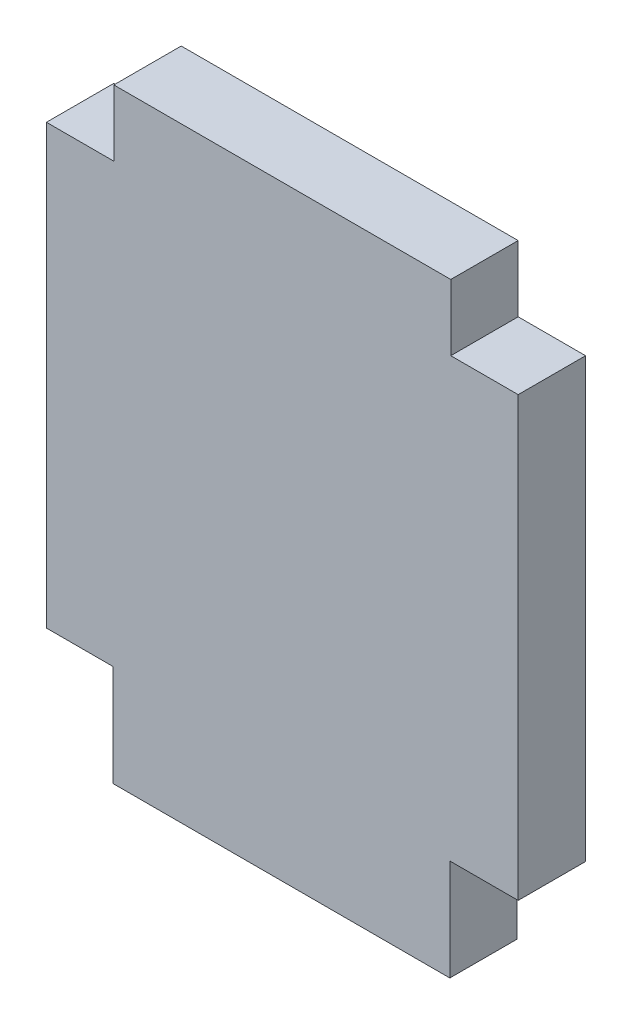
ISO-10303-21;
HEADER;
FILE_DESCRIPTION(('STEP AP214'),'2;1');
FILE_NAME('part.step','',(''),(''),'','','');
FILE_SCHEMA(('AUTOMOTIVE_DESIGN { 1 0 10303 214 1 1 1 1 }'));
ENDSEC;
DATA;
#1=APPLICATION_CONTEXT('core data for automotive mechanical design processes');
#2=APPLICATION_PROTOCOL_DEFINITION('international standard','automotive_design',2000,#1);
#3=PRODUCT_CONTEXT('',#1,'mechanical');
#4=PRODUCT('Part','Part','',(#3));
#5=PRODUCT_RELATED_PRODUCT_CATEGORY('part','',(#4));
#6=PRODUCT_DEFINITION_FORMATION('','',#4);
#7=PRODUCT_DEFINITION_CONTEXT('part definition',#1,'design');
#8=PRODUCT_DEFINITION('design','',#6,#7);
#9=PRODUCT_DEFINITION_SHAPE('','',#8);
#10=(LENGTH_UNIT() NAMED_UNIT(*) SI_UNIT(.MILLI.,.METRE.));
#11=(NAMED_UNIT(*) PLANE_ANGLE_UNIT() SI_UNIT($,.RADIAN.));
#12=(NAMED_UNIT(*) SI_UNIT($,.STERADIAN.) SOLID_ANGLE_UNIT());
#13=UNCERTAINTY_MEASURE_WITH_UNIT(LENGTH_MEASURE(1.E-05),#10,'distance_accuracy_value','');
#14=(GEOMETRIC_REPRESENTATION_CONTEXT(3) GLOBAL_UNCERTAINTY_ASSIGNED_CONTEXT((#13)) GLOBAL_UNIT_ASSIGNED_CONTEXT((#10,
#11,#12)) REPRESENTATION_CONTEXT('',''));
#15=CARTESIAN_POINT('',(0.,0.,0.));
#16=DIRECTION('',(0.,0.,1.));
#17=DIRECTION('',(1.,0.,0.));
#18=AXIS2_PLACEMENT_3D('',#15,#16,#17);
#19=CARTESIAN_POINT('',(18.2396426957653,135.965208252911,5.08));
#20=DIRECTION('',(-1.,0.,0.));
#21=DIRECTION('',(0.,0.,1.));
#22=AXIS2_PLACEMENT_3D('',#19,#20,#21);
#23=PLANE('',#22);
#24=DIRECTION('',(0.,1.,0.));
#25=VECTOR('',#24,1.);
#26=CARTESIAN_POINT('',(18.2396426957653,135.965208252911,0.));
#27=LINE('',#26,#25);
#28=CARTESIAN_POINT('',(18.2396426957653,135.965208252911,0.));
#29=VERTEX_POINT('',#28);
#30=CARTESIAN_POINT('',(18.2396426957653,140.943259367157,0.));
#31=VERTEX_POINT('',#30);
#32=EDGE_CURVE('E154',#29,#31,#27,.T.);
#33=ORIENTED_EDGE('',*,*,#32,.F.);
#34=DIRECTION('',(0.,0.,-1.));
#35=VECTOR('',#34,1.);
#36=CARTESIAN_POINT('',(18.2396426957653,135.965208252911,5.08));
#37=LINE('',#36,#35);
#38=CARTESIAN_POINT('',(18.2396426957653,135.965208252911,5.08));
#39=VERTEX_POINT('',#38);
#40=EDGE_CURVE('E11',#39,#29,#37,.T.);
#41=ORIENTED_EDGE('',*,*,#40,.F.);
#42=DIRECTION('',(0.,1.,0.));
#43=VECTOR('',#42,1.);
#44=CARTESIAN_POINT('',(18.2396426957653,135.965208252911,5.08));
#45=LINE('',#44,#43);
#46=CARTESIAN_POINT('',(18.2396426957653,140.943259367157,5.08));
#47=VERTEX_POINT('',#46);
#48=EDGE_CURVE('E186',#39,#47,#45,.T.);
#49=ORIENTED_EDGE('',*,*,#48,.T.);
#50=DIRECTION('',(0.,0.,-1.));
#51=VECTOR('',#50,1.);
#52=CARTESIAN_POINT('',(18.2396426957653,140.943259367157,5.08));
#53=LINE('',#52,#51);
#54=EDGE_CURVE('E36',#47,#31,#53,.T.);
#55=ORIENTED_EDGE('',*,*,#54,.T.);
#56=EDGE_LOOP('',(#33,#41,#49,#55));
#57=FACE_BOUND('',#56,.T.);
#58=ADVANCED_FACE('F33',(#57),#23,.T.);
#59=CARTESIAN_POINT('',(13.1596426957653,135.965208252911,5.08));
#60=DIRECTION('',(0.,1.,0.));
#61=DIRECTION('',(0.,0.,1.));
#62=AXIS2_PLACEMENT_3D('',#59,#60,#61);
#63=PLANE('',#62);
#64=DIRECTION('',(1.,0.,0.));
#65=VECTOR('',#64,1.);
#66=CARTESIAN_POINT('',(13.1596426957653,135.965208252911,0.));
#67=LINE('',#66,#65);
#68=CARTESIAN_POINT('',(13.1596426957653,135.965208252911,0.));
#69=VERTEX_POINT('',#68);
#70=EDGE_CURVE('E184',#69,#29,#67,.T.);
#71=ORIENTED_EDGE('',*,*,#70,.F.);
#72=DIRECTION('',(0.,0.,-1.));
#73=VECTOR('',#72,1.);
#74=CARTESIAN_POINT('',(13.1596426957653,135.965208252911,5.08));
#75=LINE('',#74,#73);
#76=CARTESIAN_POINT('',(13.1596426957653,135.965208252911,5.08));
#77=VERTEX_POINT('',#76);
#78=EDGE_CURVE('E42',#77,#69,#75,.T.);
#79=ORIENTED_EDGE('',*,*,#78,.F.);
#80=DIRECTION('',(1.,0.,0.));
#81=VECTOR('',#80,1.);
#82=CARTESIAN_POINT('',(13.1596426957653,135.965208252911,5.08));
#83=LINE('',#82,#81);
#84=EDGE_CURVE('E144',#77,#39,#83,.T.);
#85=ORIENTED_EDGE('',*,*,#84,.T.);
#86=ORIENTED_EDGE('',*,*,#40,.T.);
#87=EDGE_LOOP('',(#71,#79,#85,#86));
#88=FACE_BOUND('',#87,.T.);
#89=ADVANCED_FACE('F207',(#88),#63,.T.);
#90=CARTESIAN_POINT('',(13.1596426957653,122.527539749171,5.08));
#91=DIRECTION('',(-1.,0.,0.));
#92=DIRECTION('',(0.,0.,1.));
#93=AXIS2_PLACEMENT_3D('',#90,#91,#92);
#94=PLANE('',#93);
#95=DIRECTION('',(0.,1.,0.));
#96=VECTOR('',#95,1.);
#97=CARTESIAN_POINT('',(13.1596426957653,122.527539749171,0.));
#98=LINE('',#97,#96);
#99=CARTESIAN_POINT('',(13.1596426957653,102.945208252911,0.));
#100=VERTEX_POINT('',#99);
#101=EDGE_CURVE('E130',#100,#69,#98,.T.);
#102=ORIENTED_EDGE('',*,*,#101,.F.);
#103=DIRECTION('',(0.,0.,-1.));
#104=VECTOR('',#103,1.);
#105=CARTESIAN_POINT('',(13.1596426957653,102.945208252911,5.08));
#106=LINE('',#105,#104);
#107=CARTESIAN_POINT('',(13.1596426957653,102.945208252911,5.08));
#108=VERTEX_POINT('',#107);
#109=EDGE_CURVE('E126',#108,#100,#106,.T.);
#110=ORIENTED_EDGE('',*,*,#109,.F.);
#111=DIRECTION('',(0.,1.,0.));
#112=VECTOR('',#111,1.);
#113=CARTESIAN_POINT('',(13.1596426957653,102.945208252911,5.08));
#114=LINE('',#113,#112);
#115=EDGE_CURVE('E129',#108,#77,#114,.T.);
#116=ORIENTED_EDGE('',*,*,#115,.T.);
#117=ORIENTED_EDGE('',*,*,#78,.T.);
#118=EDGE_LOOP('',(#102,#110,#116,#117));
#119=FACE_BOUND('',#118,.T.);
#120=ADVANCED_FACE('F128',(#119),#94,.T.);
#121=CARTESIAN_POINT('',(18.1671687906472,102.945208252911,5.08));
#122=DIRECTION('',(0.,-1.,0.));
#123=DIRECTION('',(0.,0.,-1.));
#124=AXIS2_PLACEMENT_3D('',#121,#122,#123);
#125=PLANE('',#124);
#126=DIRECTION('',(-1.,0.,0.));
#127=VECTOR('',#126,1.);
#128=CARTESIAN_POINT('',(18.1671687906472,102.945208252911,0.));
#129=LINE('',#128,#127);
#130=CARTESIAN_POINT('',(18.1671687906472,102.945208252911,0.));
#131=VERTEX_POINT('',#130);
#132=EDGE_CURVE('E181',#131,#100,#129,.T.);
#133=ORIENTED_EDGE('',*,*,#132,.F.);
#134=DIRECTION('',(0.,0.,-1.));
#135=VECTOR('',#134,1.);
#136=CARTESIAN_POINT('',(18.1671687906472,102.945208252911,5.08));
#137=LINE('',#136,#135);
#138=CARTESIAN_POINT('',(18.1671687906472,102.945208252911,5.08));
#139=VERTEX_POINT('',#138);
#140=EDGE_CURVE('E135',#139,#131,#137,.T.);
#141=ORIENTED_EDGE('',*,*,#140,.F.);
#142=DIRECTION('',(-1.,0.,0.));
#143=VECTOR('',#142,1.);
#144=CARTESIAN_POINT('',(18.1671687906472,102.945208252911,5.08));
#145=LINE('',#144,#143);
#146=EDGE_CURVE('E142',#139,#108,#145,.T.);
#147=ORIENTED_EDGE('',*,*,#146,.T.);
#148=ORIENTED_EDGE('',*,*,#109,.T.);
#149=EDGE_LOOP('',(#133,#141,#147,#148));
#150=FACE_BOUND('',#149,.T.);
#151=ADVANCED_FACE('F146',(#150),#125,.T.);
#152=CARTESIAN_POINT('',(18.1671687906472,95.3054468690553,5.08));
#153=DIRECTION('',(-1.,0.,0.));
#154=DIRECTION('',(0.,0.,1.));
#155=AXIS2_PLACEMENT_3D('',#152,#153,#154);
#156=PLANE('',#155);
#157=DIRECTION('',(0.,1.,0.));
#158=VECTOR('',#157,1.);
#159=CARTESIAN_POINT('',(18.1671687906472,95.3054468690553,0.));
#160=LINE('',#159,#158);
#161=CARTESIAN_POINT('',(18.1671687906472,95.3054468690553,0.));
#162=VERTEX_POINT('',#161);
#163=EDGE_CURVE('E178',#162,#131,#160,.T.);
#164=ORIENTED_EDGE('',*,*,#163,.F.);
#165=DIRECTION('',(0.,0.,-1.));
#166=VECTOR('',#165,1.);
#167=CARTESIAN_POINT('',(18.1671687906472,95.3054468690553,5.08));
#168=LINE('',#167,#166);
#169=CARTESIAN_POINT('',(18.1671687906472,95.3054468690553,5.08));
#170=VERTEX_POINT('',#169);
#171=EDGE_CURVE('E190',#170,#162,#168,.T.);
#172=ORIENTED_EDGE('',*,*,#171,.F.);
#173=DIRECTION('',(0.,1.,0.));
#174=VECTOR('',#173,1.);
#175=CARTESIAN_POINT('',(18.1671687906472,95.3054468690553,5.08));
#176=LINE('',#175,#174);
#177=EDGE_CURVE('E147',#170,#139,#176,.T.);
#178=ORIENTED_EDGE('',*,*,#177,.T.);
#179=ORIENTED_EDGE('',*,*,#140,.T.);
#180=EDGE_LOOP('',(#164,#172,#178,#179));
#181=FACE_BOUND('',#180,.T.);
#182=ADVANCED_FACE('F220',(#181),#156,.T.);
#183=CARTESIAN_POINT('',(43.567168790647,95.3054468690553,5.08));
#184=DIRECTION('',(0.,-1.,0.));
#185=DIRECTION('',(0.,0.,-1.));
#186=AXIS2_PLACEMENT_3D('',#183,#184,#185);
#187=PLANE('',#186);
#188=DIRECTION('',(-1.,0.,0.));
#189=VECTOR('',#188,1.);
#190=CARTESIAN_POINT('',(43.567168790647,95.3054468690553,0.));
#191=LINE('',#190,#189);
#192=CARTESIAN_POINT('',(43.567168790647,95.3054468690553,0.));
#193=VERTEX_POINT('',#192);
#194=EDGE_CURVE('E175',#193,#162,#191,.T.);
#195=ORIENTED_EDGE('',*,*,#194,.F.);
#196=DIRECTION('',(0.,0.,-1.));
#197=VECTOR('',#196,1.);
#198=CARTESIAN_POINT('',(43.567168790647,95.3054468690553,5.08));
#199=LINE('',#198,#197);
#200=CARTESIAN_POINT('',(43.567168790647,95.3054468690553,5.08));
#201=VERTEX_POINT('',#200);
#202=EDGE_CURVE('E192',#201,#193,#199,.T.);
#203=ORIENTED_EDGE('',*,*,#202,.F.);
#204=DIRECTION('',(-1.,0.,0.));
#205=VECTOR('',#204,1.);
#206=CARTESIAN_POINT('',(43.567168790647,95.3054468690553,5.08));
#207=LINE('',#206,#205);
#208=EDGE_CURVE('E149',#201,#170,#207,.T.);
#209=ORIENTED_EDGE('',*,*,#208,.T.);
#210=ORIENTED_EDGE('',*,*,#171,.T.);
#211=EDGE_LOOP('',(#195,#203,#209,#210));
#212=FACE_BOUND('',#211,.T.);
#213=ADVANCED_FACE('F223',(#212),#187,.T.);
#214=CARTESIAN_POINT('',(43.567168790647,102.945208252911,5.08));
#215=DIRECTION('',(1.,0.,0.));
#216=DIRECTION('',(0.,0.,-1.));
#217=AXIS2_PLACEMENT_3D('',#214,#215,#216);
#218=PLANE('',#217);
#219=DIRECTION('',(0.,-1.,0.));
#220=VECTOR('',#219,1.);
#221=CARTESIAN_POINT('',(43.567168790647,102.945208252911,0.));
#222=LINE('',#221,#220);
#223=CARTESIAN_POINT('',(43.567168790647,102.945208252911,0.));
#224=VERTEX_POINT('',#223);
#225=EDGE_CURVE('E172',#224,#193,#222,.T.);
#226=ORIENTED_EDGE('',*,*,#225,.F.);
#227=DIRECTION('',(0.,0.,-1.));
#228=VECTOR('',#227,1.);
#229=CARTESIAN_POINT('',(43.567168790647,102.945208252911,5.08));
#230=LINE('',#229,#228);
#231=CARTESIAN_POINT('',(43.567168790647,102.945208252911,5.08));
#232=VERTEX_POINT('',#231);
#233=EDGE_CURVE('E194',#232,#224,#230,.T.);
#234=ORIENTED_EDGE('',*,*,#233,.F.);
#235=DIRECTION('',(0.,-1.,0.));
#236=VECTOR('',#235,1.);
#237=CARTESIAN_POINT('',(43.567168790647,102.945208252911,5.08));
#238=LINE('',#237,#236);
#239=EDGE_CURVE('E354',#232,#201,#238,.T.);
#240=ORIENTED_EDGE('',*,*,#239,.T.);
#241=ORIENTED_EDGE('',*,*,#202,.T.);
#242=EDGE_LOOP('',(#226,#234,#240,#241));
#243=FACE_BOUND('',#242,.T.);
#244=ADVANCED_FACE('F227',(#243),#218,.T.);
#245=CARTESIAN_POINT('',(48.7196426957652,102.945208252911,5.08));
#246=DIRECTION('',(0.,-1.,0.));
#247=DIRECTION('',(0.,0.,-1.));
#248=AXIS2_PLACEMENT_3D('',#245,#246,#247);
#249=PLANE('',#248);
#250=DIRECTION('',(-1.,0.,0.));
#251=VECTOR('',#250,1.);
#252=CARTESIAN_POINT('',(48.7196426957652,102.945208252911,0.));
#253=LINE('',#252,#251);
#254=CARTESIAN_POINT('',(48.7196426957652,102.945208252911,0.));
#255=VERTEX_POINT('',#254);
#256=EDGE_CURVE('E169',#255,#224,#253,.T.);
#257=ORIENTED_EDGE('',*,*,#256,.F.);
#258=DIRECTION('',(0.,0.,-1.));
#259=VECTOR('',#258,1.);
#260=CARTESIAN_POINT('',(48.7196426957652,102.945208252911,5.08));
#261=LINE('',#260,#259);
#262=CARTESIAN_POINT('',(48.7196426957652,102.945208252911,5.08));
#263=VERTEX_POINT('',#262);
#264=EDGE_CURVE('E196',#263,#255,#261,.T.);
#265=ORIENTED_EDGE('',*,*,#264,.F.);
#266=DIRECTION('',(-1.,0.,0.));
#267=VECTOR('',#266,1.);
#268=CARTESIAN_POINT('',(48.7196426957652,102.945208252911,5.08));
#269=LINE('',#268,#267);
#270=EDGE_CURVE('E358',#263,#232,#269,.T.);
#271=ORIENTED_EDGE('',*,*,#270,.T.);
#272=ORIENTED_EDGE('',*,*,#233,.T.);
#273=EDGE_LOOP('',(#257,#265,#271,#272));
#274=FACE_BOUND('',#273,.T.);
#275=ADVANCED_FACE('F231',(#274),#249,.T.);
#276=CARTESIAN_POINT('',(48.7196426957652,122.527539749171,5.08));
#277=DIRECTION('',(1.,0.,0.));
#278=DIRECTION('',(0.,0.,-1.));
#279=AXIS2_PLACEMENT_3D('',#276,#277,#278);
#280=PLANE('',#279);
#281=DIRECTION('',(0.,-1.,0.));
#282=VECTOR('',#281,1.);
#283=CARTESIAN_POINT('',(48.7196426957652,122.527539749171,0.));
#284=LINE('',#283,#282);
#285=CARTESIAN_POINT('',(48.7196426957652,135.965208252911,0.));
#286=VERTEX_POINT('',#285);
#287=EDGE_CURVE('E166',#286,#255,#284,.T.);
#288=ORIENTED_EDGE('',*,*,#287,.F.);
#289=DIRECTION('',(0.,0.,-1.));
#290=VECTOR('',#289,1.);
#291=CARTESIAN_POINT('',(48.7196426957652,135.965208252911,5.08));
#292=LINE('',#291,#290);
#293=CARTESIAN_POINT('',(48.7196426957652,135.965208252911,5.08));
#294=VERTEX_POINT('',#293);
#295=EDGE_CURVE('E198',#294,#286,#292,.T.);
#296=ORIENTED_EDGE('',*,*,#295,.F.);
#297=DIRECTION('',(0.,-1.,0.));
#298=VECTOR('',#297,1.);
#299=CARTESIAN_POINT('',(48.7196426957652,135.965208252911,5.08));
#300=LINE('',#299,#298);
#301=EDGE_CURVE('E345',#294,#263,#300,.T.);
#302=ORIENTED_EDGE('',*,*,#301,.T.);
#303=ORIENTED_EDGE('',*,*,#264,.T.);
#304=EDGE_LOOP('',(#288,#296,#302,#303));
#305=FACE_BOUND('',#304,.T.);
#306=ADVANCED_FACE('F235',(#305),#280,.T.);
#307=CARTESIAN_POINT('',(48.7196426957652,135.965208252911,5.08));
#308=DIRECTION('',(0.,-1.,0.));
#309=DIRECTION('',(0.,0.,-1.));
#310=AXIS2_PLACEMENT_3D('',#307,#308,#309);
#311=PLANE('',#310);
#312=DIRECTION('',(-1.,0.,0.));
#313=VECTOR('',#312,1.);
#314=CARTESIAN_POINT('',(48.7196426957652,135.965208252911,0.));
#315=LINE('',#314,#313);
#316=CARTESIAN_POINT('',(43.639642695765,135.965208252911,0.));
#317=VERTEX_POINT('',#316);
#318=EDGE_CURVE('E163',#286,#317,#315,.T.);
#319=ORIENTED_EDGE('',*,*,#318,.T.);
#320=DIRECTION('',(0.,0.,-1.));
#321=VECTOR('',#320,1.);
#322=CARTESIAN_POINT('',(43.639642695765,135.965208252911,5.08));
#323=LINE('',#322,#321);
#324=CARTESIAN_POINT('',(43.639642695765,135.965208252911,5.08));
#325=VERTEX_POINT('',#324);
#326=EDGE_CURVE('E201',#325,#317,#323,.T.);
#327=ORIENTED_EDGE('',*,*,#326,.F.);
#328=DIRECTION('',(-1.,0.,0.));
#329=VECTOR('',#328,1.);
#330=CARTESIAN_POINT('',(48.7196426957652,135.965208252911,5.08));
#331=LINE('',#330,#329);
#332=EDGE_CURVE('E343',#294,#325,#331,.T.);
#333=ORIENTED_EDGE('',*,*,#332,.F.);
#334=ORIENTED_EDGE('',*,*,#295,.T.);
#335=EDGE_LOOP('',(#319,#327,#333,#334));
#336=FACE_BOUND('',#335,.T.);
#337=ADVANCED_FACE('F239',(#336),#311,.F.);
#338=CARTESIAN_POINT('',(43.639642695765,140.943259367157,5.08));
#339=DIRECTION('',(1.,0.,0.));
#340=DIRECTION('',(0.,0.,-1.));
#341=AXIS2_PLACEMENT_3D('',#338,#339,#340);
#342=PLANE('',#341);
#343=DIRECTION('',(0.,-1.,0.));
#344=VECTOR('',#343,1.);
#345=CARTESIAN_POINT('',(43.639642695765,140.943259367157,0.));
#346=LINE('',#345,#344);
#347=CARTESIAN_POINT('',(43.639642695765,140.943259367157,0.));
#348=VERTEX_POINT('',#347);
#349=EDGE_CURVE('E160',#348,#317,#346,.T.);
#350=ORIENTED_EDGE('',*,*,#349,.F.);
#351=DIRECTION('',(0.,0.,-1.));
#352=VECTOR('',#351,1.);
#353=CARTESIAN_POINT('',(43.639642695765,140.943259367157,5.08));
#354=LINE('',#353,#352);
#355=CARTESIAN_POINT('',(43.639642695765,140.943259367157,5.08));
#356=VERTEX_POINT('',#355);
#357=EDGE_CURVE('E202',#356,#348,#354,.T.);
#358=ORIENTED_EDGE('',*,*,#357,.F.);
#359=DIRECTION('',(0.,-1.,0.));
#360=VECTOR('',#359,1.);
#361=CARTESIAN_POINT('',(43.639642695765,140.943259367157,5.08));
#362=LINE('',#361,#360);
#363=EDGE_CURVE('E364',#356,#325,#362,.T.);
#364=ORIENTED_EDGE('',*,*,#363,.T.);
#365=ORIENTED_EDGE('',*,*,#326,.T.);
#366=EDGE_LOOP('',(#350,#358,#364,#365));
#367=FACE_BOUND('',#366,.T.);
#368=ADVANCED_FACE('F243',(#367),#342,.T.);
#369=CARTESIAN_POINT('',(18.2396426957653,140.943259367157,5.08));
#370=DIRECTION('',(0.,1.,0.));
#371=DIRECTION('',(0.,0.,1.));
#372=AXIS2_PLACEMENT_3D('',#369,#370,#371);
#373=PLANE('',#372);
#374=DIRECTION('',(1.,0.,0.));
#375=VECTOR('',#374,1.);
#376=CARTESIAN_POINT('',(18.2396426957653,140.943259367157,0.));
#377=LINE('',#376,#375);
#378=EDGE_CURVE('E157',#31,#348,#377,.T.);
#379=ORIENTED_EDGE('',*,*,#378,.F.);
#380=ORIENTED_EDGE('',*,*,#54,.F.);
#381=DIRECTION('',(1.,0.,0.));
#382=VECTOR('',#381,1.);
#383=CARTESIAN_POINT('',(18.2396426957653,140.943259367157,5.08));
#384=LINE('',#383,#382);
#385=EDGE_CURVE('E366',#47,#356,#384,.T.);
#386=ORIENTED_EDGE('',*,*,#385,.T.);
#387=ORIENTED_EDGE('',*,*,#357,.T.);
#388=EDGE_LOOP('',(#379,#380,#386,#387));
#389=FACE_BOUND('',#388,.T.);
#390=ADVANCED_FACE('F204',(#389),#373,.T.);
#391=CARTESIAN_POINT('',(0.,0.,5.08));
#392=DIRECTION('',(0.,0.,-1.));
#393=DIRECTION('',(-1.,0.,0.));
#394=AXIS2_PLACEMENT_3D('',#391,#392,#393);
#395=PLANE('',#394);
#396=ORIENTED_EDGE('',*,*,#48,.F.);
#397=ORIENTED_EDGE('',*,*,#84,.F.);
#398=ORIENTED_EDGE('',*,*,#115,.F.);
#399=ORIENTED_EDGE('',*,*,#146,.F.);
#400=ORIENTED_EDGE('',*,*,#177,.F.);
#401=ORIENTED_EDGE('',*,*,#208,.F.);
#402=ORIENTED_EDGE('',*,*,#239,.F.);
#403=ORIENTED_EDGE('',*,*,#270,.F.);
#404=ORIENTED_EDGE('',*,*,#301,.F.);
#405=ORIENTED_EDGE('',*,*,#332,.T.);
#406=ORIENTED_EDGE('',*,*,#363,.F.);
#407=ORIENTED_EDGE('',*,*,#385,.F.);
#408=EDGE_LOOP('',(#396,#397,#398,#399,#400,#401,#402,#403,#404,#405,#406,#407));
#409=FACE_BOUND('',#408,.T.);
#410=ADVANCED_FACE('F140',(#409),#395,.F.);
#411=CARTESIAN_POINT('',(0.,0.,0.));
#412=DIRECTION('',(0.,0.,-1.));
#413=DIRECTION('',(-1.,0.,0.));
#414=AXIS2_PLACEMENT_3D('',#411,#412,#413);
#415=PLANE('',#414);
#416=ORIENTED_EDGE('',*,*,#32,.T.);
#417=ORIENTED_EDGE('',*,*,#378,.T.);
#418=ORIENTED_EDGE('',*,*,#349,.T.);
#419=ORIENTED_EDGE('',*,*,#318,.F.);
#420=ORIENTED_EDGE('',*,*,#287,.T.);
#421=ORIENTED_EDGE('',*,*,#256,.T.);
#422=ORIENTED_EDGE('',*,*,#225,.T.);
#423=ORIENTED_EDGE('',*,*,#194,.T.);
#424=ORIENTED_EDGE('',*,*,#163,.T.);
#425=ORIENTED_EDGE('',*,*,#132,.T.);
#426=ORIENTED_EDGE('',*,*,#101,.T.);
#427=ORIENTED_EDGE('',*,*,#70,.T.);
#428=EDGE_LOOP('',(#416,#417,#418,#419,#420,#421,#422,#423,#424,#425,#426,#427));
#429=FACE_BOUND('',#428,.T.);
#430=ADVANCED_FACE('F206',(#429),#415,.T.);
#431=CLOSED_SHELL('',(#58,#89,#120,#151,#182,#213,#244,#275,#306,#337,#368,#390,#410,#430));
#432=MANIFOLD_SOLID_BREP('B2',#431);
#433=ADVANCED_BREP_SHAPE_REPRESENTATION('',(#18,#432),#14);
#434=SHAPE_DEFINITION_REPRESENTATION(#9,#433);
ENDSEC;
END-ISO-10303-21;
